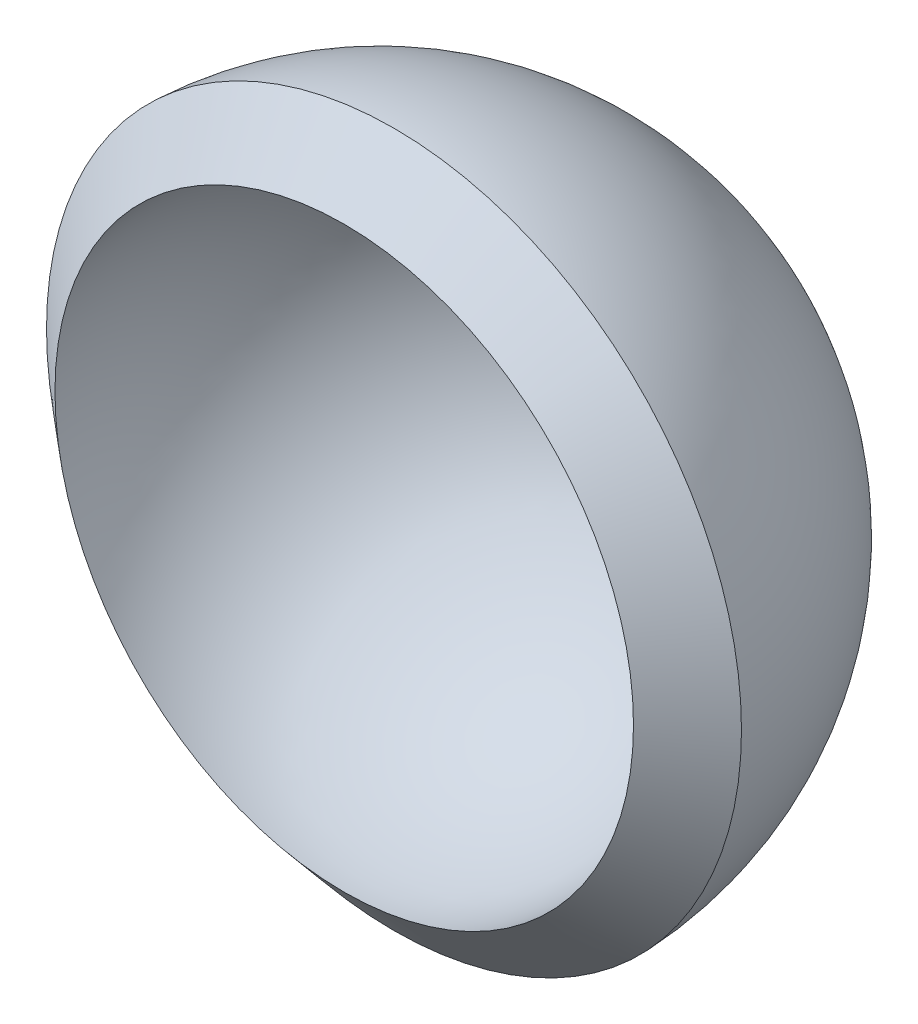
ISO-10303-21;
HEADER;
FILE_DESCRIPTION(('STEP AP214'),'2;1');
FILE_NAME('part.step','',(''),(''),'','','');
FILE_SCHEMA(('AUTOMOTIVE_DESIGN { 1 0 10303 214 1 1 1 1 }'));
ENDSEC;
DATA;
#1=APPLICATION_CONTEXT('core data for automotive mechanical design processes');
#2=APPLICATION_PROTOCOL_DEFINITION('international standard','automotive_design',2000,#1);
#3=PRODUCT_CONTEXT('',#1,'mechanical');
#4=PRODUCT('Part','Part','',(#3));
#5=PRODUCT_RELATED_PRODUCT_CATEGORY('part','',(#4));
#6=PRODUCT_DEFINITION_FORMATION('','',#4);
#7=PRODUCT_DEFINITION_CONTEXT('part definition',#1,'design');
#8=PRODUCT_DEFINITION('design','',#6,#7);
#9=PRODUCT_DEFINITION_SHAPE('','',#8);
#10=(LENGTH_UNIT() NAMED_UNIT(*) SI_UNIT(.MILLI.,.METRE.));
#11=(NAMED_UNIT(*) PLANE_ANGLE_UNIT() SI_UNIT($,.RADIAN.));
#12=(NAMED_UNIT(*) SI_UNIT($,.STERADIAN.) SOLID_ANGLE_UNIT());
#13=UNCERTAINTY_MEASURE_WITH_UNIT(LENGTH_MEASURE(1.E-05),#10,'distance_accuracy_value','');
#14=(GEOMETRIC_REPRESENTATION_CONTEXT(3) GLOBAL_UNCERTAINTY_ASSIGNED_CONTEXT((#13)) GLOBAL_UNIT_ASSIGNED_CONTEXT((#10,
#11,#12)) REPRESENTATION_CONTEXT('',''));
#15=CARTESIAN_POINT('',(0.,0.,0.));
#16=DIRECTION('',(0.,0.,1.));
#17=DIRECTION('',(1.,0.,0.));
#18=AXIS2_PLACEMENT_3D('',#15,#16,#17);
#19=CARTESIAN_POINT('',(0.,0.,-12.33));
#20=DIRECTION('',(0.,0.,-1.));
#21=DIRECTION('',(1.,0.,0.));
#22=AXIS2_PLACEMENT_3D('',#19,#20,#21);
#23=SPHERICAL_SURFACE('',#22,3.);
#24=CARTESIAN_POINT('',(0.,0.,-11.9650364963504));
#25=DIRECTION('',(0.,0.,-1.));
#26=DIRECTION('',(-1.,0.,0.));
#27=AXIS2_PLACEMENT_3D('',#24,#25,#26);
#28=CIRCLE('',#27,2.97771752202988);
#29=CARTESIAN_POINT('',(-2.97771752202988,0.,-11.9650364963504));
#30=VERTEX_POINT('',#29);
#31=EDGE_CURVE('E10',#30,#30,#28,.T.);
#32=ORIENTED_EDGE('',*,*,#31,.F.);
#33=EDGE_LOOP('',(#32));
#34=FACE_BOUND('',#33,.T.);
#35=ADVANCED_FACE('F33',(#34),#23,.F.);
#36=CARTESIAN_POINT('',(0.,0.,-11.9650364963504));
#37=DIRECTION('',(0.,0.,-1.));
#38=DIRECTION('',(-1.,0.,0.));
#39=AXIS2_PLACEMENT_3D('',#36,#37,#38);
#40=CONICAL_SURFACE('',#39,2.97771752202988,0.863390635833672);
#41=CARTESIAN_POINT('',(0.,0.,-12.4774087591241));
#42=DIRECTION('',(0.,0.,-1.));
#43=DIRECTION('',(-1.,0.,0.));
#44=AXIS2_PLACEMENT_3D('',#41,#42,#43);
#45=CIRCLE('',#44,3.57696388823448);
#46=CARTESIAN_POINT('',(-3.57696388823448,0.,-12.4774087591241));
#47=VERTEX_POINT('',#46);
#48=EDGE_CURVE('E39',#47,#47,#45,.T.);
#49=ORIENTED_EDGE('',*,*,#48,.F.);
#50=EDGE_LOOP('',(#49));
#51=FACE_BOUND('',#50,.T.);
#52=ORIENTED_EDGE('',*,*,#31,.T.);
#53=EDGE_LOOP('',(#52));
#54=FACE_BOUND('',#53,.T.);
#55=ADVANCED_FACE('F47',(#51,#54),#40,.T.);
#56=CARTESIAN_POINT('',(0.,0.,-12.33));
#57=DIRECTION('',(0.,0.,-1.));
#58=DIRECTION('',(1.,0.,0.));
#59=AXIS2_PLACEMENT_3D('',#56,#57,#58);
#60=SPHERICAL_SURFACE('',#59,3.58);
#61=ORIENTED_EDGE('',*,*,#48,.T.);
#62=EDGE_LOOP('',(#61));
#63=FACE_BOUND('',#62,.T.);
#64=ADVANCED_FACE('F45',(#63),#60,.T.);
#65=CLOSED_SHELL('',(#35,#55,#64));
#66=MANIFOLD_SOLID_BREP('B2',#65);
#67=ADVANCED_BREP_SHAPE_REPRESENTATION('',(#18,#66),#14);
#68=SHAPE_DEFINITION_REPRESENTATION(#9,#67);
ENDSEC;
END-ISO-10303-21;
